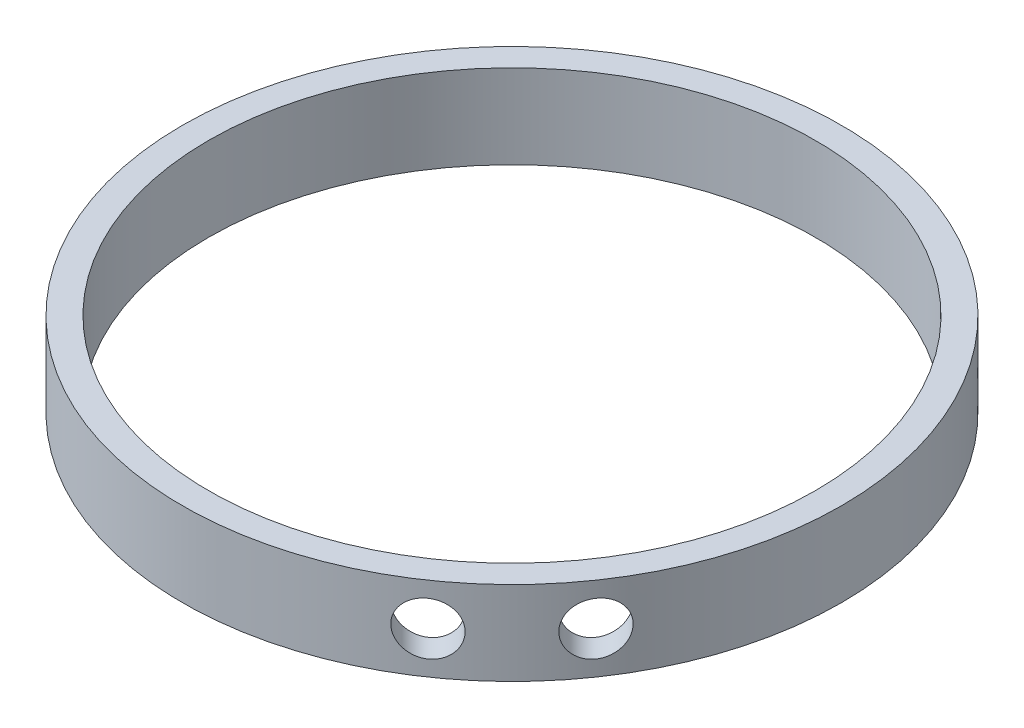
ISO-10303-21;
HEADER;
FILE_DESCRIPTION(('STEP AP214'),'2;1');
FILE_NAME('part.step','',(''),(''),'','','');
FILE_SCHEMA(('AUTOMOTIVE_DESIGN { 1 0 10303 214 1 1 1 1 }'));
ENDSEC;
DATA;
#1=APPLICATION_CONTEXT('core data for automotive mechanical design processes');
#2=APPLICATION_PROTOCOL_DEFINITION('international standard','automotive_design',2000,#1);
#3=PRODUCT_CONTEXT('',#1,'mechanical');
#4=PRODUCT('Part','Part','',(#3));
#5=PRODUCT_RELATED_PRODUCT_CATEGORY('part','',(#4));
#6=PRODUCT_DEFINITION_FORMATION('','',#4);
#7=PRODUCT_DEFINITION_CONTEXT('part definition',#1,'design');
#8=PRODUCT_DEFINITION('design','',#6,#7);
#9=PRODUCT_DEFINITION_SHAPE('','',#8);
#10=(LENGTH_UNIT() NAMED_UNIT(*) SI_UNIT(.MILLI.,.METRE.));
#11=(NAMED_UNIT(*) PLANE_ANGLE_UNIT() SI_UNIT($,.RADIAN.));
#12=(NAMED_UNIT(*) SI_UNIT($,.STERADIAN.) SOLID_ANGLE_UNIT());
#13=UNCERTAINTY_MEASURE_WITH_UNIT(LENGTH_MEASURE(1.E-05),#10,'distance_accuracy_value','');
#14=(GEOMETRIC_REPRESENTATION_CONTEXT(3) GLOBAL_UNCERTAINTY_ASSIGNED_CONTEXT((#13)) GLOBAL_UNIT_ASSIGNED_CONTEXT((#10,
#11,#12)) REPRESENTATION_CONTEXT('',''));
#15=CARTESIAN_POINT('',(0.,0.,0.));
#16=DIRECTION('',(0.,0.,1.));
#17=DIRECTION('',(1.,0.,0.));
#18=AXIS2_PLACEMENT_3D('',#15,#16,#17);
#19=CARTESIAN_POINT('',(50.6984,108.966,0.));
#20=DIRECTION('',(0.,-1.,0.));
#21=DIRECTION('',(1.,0.,0.));
#22=AXIS2_PLACEMENT_3D('',#19,#20,#21);
#23=PLANE('',#22);
#24=CARTESIAN_POINT('',(0.,108.966,0.));
#25=DIRECTION('',(0.,1.,0.));
#26=DIRECTION('',(-1.,0.,0.));
#27=AXIS2_PLACEMENT_3D('',#24,#25,#26);
#28=CIRCLE('',#27,52.832);
#29=CARTESIAN_POINT('',(-52.832,108.966,0.));
#30=VERTEX_POINT('',#29);
#31=EDGE_CURVE('E49',#30,#30,#28,.T.);
#32=ORIENTED_EDGE('',*,*,#31,.T.);
#33=EDGE_LOOP('',(#32));
#34=FACE_BOUND('',#33,.T.);
#35=CARTESIAN_POINT('',(0.,108.966,0.));
#36=DIRECTION('',(0.,-1.,0.));
#37=DIRECTION('',(1.,0.,0.));
#38=AXIS2_PLACEMENT_3D('',#35,#36,#37);
#39=CIRCLE('',#38,48.641);
#40=CARTESIAN_POINT('',(48.641,108.966,0.));
#41=VERTEX_POINT('',#40);
#42=EDGE_CURVE('E93',#41,#41,#39,.T.);
#43=ORIENTED_EDGE('',*,*,#42,.T.);
#44=EDGE_LOOP('',(#43));
#45=FACE_BOUND('',#44,.T.);
#46=ADVANCED_FACE('F37',(#34,#45),#23,.F.);
#47=CARTESIAN_POINT('',(0.,138.931800571307,0.));
#48=DIRECTION('',(0.,1.,0.));
#49=DIRECTION('',(-1.,0.,0.));
#50=AXIS2_PLACEMENT_3D('',#47,#48,#49);
#51=CYLINDRICAL_SURFACE('',#50,52.832);
#52=CARTESIAN_POINT('',(35.9911854648936,102.235,-38.6762820450936));
#53=CARTESIAN_POINT('',(35.9911891251565,102.128388948194,-38.6762790353523));
#54=CARTESIAN_POINT('',(35.9977870100752,102.021701469772,-38.6701420674387));
#55=CARTESIAN_POINT('',(36.0239957140699,101.811267276668,-38.6457276445082));
#56=CARTESIAN_POINT('',(36.043622025432,101.707524216566,-38.6274357358532));
#57=CARTESIAN_POINT('',(36.0952698779711,101.506057813562,-38.5791777823933));
#58=CARTESIAN_POINT('',(36.1272852928998,101.408331523088,-38.5492175073947));
#59=CARTESIAN_POINT('',(36.2027070266943,101.221649723681,-38.4783951198653));
#60=CARTESIAN_POINT('',(36.2461105873962,101.132692098181,-38.4375356470373));
#61=CARTESIAN_POINT('',(36.3429988416192,100.96599296856,-38.345939712509));
#62=CARTESIAN_POINT('',(36.3964886465669,100.888257186777,-38.2951982424591));
#63=CARTESIAN_POINT('',(36.511905302874,100.746256785229,-38.1851717077652));
#64=CARTESIAN_POINT('',(36.5738324920968,100.681992705181,-38.1258863009854));
#65=CARTESIAN_POINT('',(36.7042725394263,100.568748154399,-38.0003261293154));
#66=CARTESIAN_POINT('',(36.7727870537462,100.519771540518,-37.93404960628));
#67=CARTESIAN_POINT('',(36.9143499540226,100.43851712426,-37.7963058372317));
#68=CARTESIAN_POINT('',(36.9873983178574,100.406239240414,-37.724838616545));
#69=CARTESIAN_POINT('',(37.1358550292209,100.359312002503,-37.5787085060975));
#70=CARTESIAN_POINT('',(37.2112623346822,100.344654974139,-37.5040470221966));
#71=CARTESIAN_POINT('',(37.3622933241103,100.333361847808,-37.3535891440961));
#72=CARTESIAN_POINT('',(37.4379170070065,100.336725660826,-37.2777927555043));
#73=CARTESIAN_POINT('',(37.5872047581345,100.361372296027,-37.1272608371456));
#74=CARTESIAN_POINT('',(37.6608697150397,100.382646843909,-37.0525248337166));
#75=CARTESIAN_POINT('',(37.8042316035084,100.442498233258,-36.9062432670479));
#76=CARTESIAN_POINT('',(37.8739285244002,100.481075121256,-36.8346977123888));
#77=CARTESIAN_POINT('',(38.0074723074687,100.574445613952,-36.6968866836979));
#78=CARTESIAN_POINT('',(38.0713177990794,100.62924300529,-36.6306224471678));
#79=CARTESIAN_POINT('',(38.1914340384486,100.753496211505,-36.5053712780388));
#80=CARTESIAN_POINT('',(38.2477047600365,100.822952077023,-36.446384370583));
#81=CARTESIAN_POINT('',(38.3512218164106,100.974597453319,-36.3374417403975));
#82=CARTESIAN_POINT('',(38.3984630300379,101.056794142586,-36.2874911435394));
#83=CARTESIAN_POINT('',(38.4826556609733,101.231562610481,-36.1981935454399));
#84=CARTESIAN_POINT('',(38.5196070763824,101.324134391024,-36.1588465461553));
#85=CARTESIAN_POINT('',(38.5822717844099,101.517029415104,-36.0919747096342));
#86=CARTESIAN_POINT('',(38.6079849087677,101.617352774671,-36.0644500494028));
#87=CARTESIAN_POINT('',(38.6475164071539,101.822901262283,-36.0220841469506));
#88=CARTESIAN_POINT('',(38.6613348275305,101.928126371226,-36.0072428553084));
#89=CARTESIAN_POINT('',(38.6767217960953,102.140428338628,-35.9907147107065));
#90=CARTESIAN_POINT('',(38.6782971928635,102.247504128238,-35.9890205034482));
#91=CARTESIAN_POINT('',(38.6691762593249,102.460523355244,-35.9988204600144));
#92=CARTESIAN_POINT('',(38.6584799496777,102.566466794546,-36.010314601636));
#93=CARTESIAN_POINT('',(38.6250912417336,102.774185901556,-36.0461252209459));
#94=CARTESIAN_POINT('',(38.6024019687354,102.875962647639,-36.0704383580722));
#95=CARTESIAN_POINT('',(38.5456061073569,103.072492434298,-36.1311249623008));
#96=CARTESIAN_POINT('',(38.5114994854134,103.167245454226,-36.1674984648565));
#97=CARTESIAN_POINT('',(38.4327238287584,103.347084341653,-36.251196597733));
#98=CARTESIAN_POINT('',(38.3880501003922,103.432165888381,-36.2985260942427));
#99=CARTESIAN_POINT('',(38.2893030662616,103.590203258514,-36.4026733963121));
#100=CARTESIAN_POINT('',(38.2352297276956,103.663159039602,-36.4594912349831));
#101=CARTESIAN_POINT('',(38.1190729837629,103.794907505079,-36.5809178098473));
#102=CARTESIAN_POINT('',(38.0569859342879,103.85369371099,-36.64553008956));
#103=CARTESIAN_POINT('',(37.9264752799857,103.955390016683,-36.7805859584982));
#104=CARTESIAN_POINT('',(37.8580516927094,103.998300160437,-36.8510295315723));
#105=CARTESIAN_POINT('',(37.7167420562791,104.067014919109,-36.995645720619));
#106=CARTESIAN_POINT('',(37.6438571033809,104.092823717918,-37.0698174197141));
#107=CARTESIAN_POINT('',(37.4956255624286,104.126616883972,-37.2197447052237));
#108=CARTESIAN_POINT('',(37.4202789793993,104.134601287597,-37.295500288405));
#109=CARTESIAN_POINT('',(37.2692914252668,104.132518545475,-37.4463820050562));
#110=CARTESIAN_POINT('',(37.1936506444338,104.122461591004,-37.5215084698223));
#111=CARTESIAN_POINT('',(37.0442013161862,104.084602607981,-37.6690642921508));
#112=CARTESIAN_POINT('',(36.9703927723641,104.056800544638,-37.7414936444246));
#113=CARTESIAN_POINT('',(36.8267589213333,103.984242239172,-37.881659542266));
#114=CARTESIAN_POINT('',(36.7569336743323,103.93948574086,-37.9493960169037));
#115=CARTESIAN_POINT('',(36.6233364041532,103.834291732404,-38.078341416311));
#116=CARTESIAN_POINT('',(36.5595641702965,103.773854768302,-38.1395505682772));
#117=CARTESIAN_POINT('',(36.4399559147707,103.638982329924,-38.253845503396));
#118=CARTESIAN_POINT('',(36.3841235403764,103.564540458556,-38.3069275541142));
#119=CARTESIAN_POINT('',(36.2821148122894,103.403762323211,-38.4035586891762));
#120=CARTESIAN_POINT('',(36.2359408491869,103.317423123232,-38.4471054135196));
#121=CARTESIAN_POINT('',(36.154659073159,103.135259116699,-38.5235509361549));
#122=CARTESIAN_POINT('',(36.1195592939607,103.039427489813,-38.5564420048014));
#123=CARTESIAN_POINT('',(36.0615953242634,102.841120551884,-38.6106611806726));
#124=CARTESIAN_POINT('',(36.0387165771221,102.738653308543,-38.6320030447147));
#125=CARTESIAN_POINT('',(36.0119587205039,102.568784464662,-38.6569429440298));
#126=CARTESIAN_POINT('',(36.0041794195579,102.502484907529,-38.6641867821554));
#127=CARTESIAN_POINT('',(35.9937916413014,102.36913365298,-38.6738572785532));
#128=CARTESIAN_POINT('',(35.9911831617778,102.302081955887,-38.6762839388873));
#129=CARTESIAN_POINT('',(35.9911854648936,102.235,-38.6762820450936));
#130=B_SPLINE_CURVE_WITH_KNOTS('',3,(#52,#53,#54,#55,#56,#57,#58,#59,#60,#61,#62,#63,#64,#65,
#66,#67,#68,#69,#70,#71,#72,#73,#74,#75,#76,#77,#78,#79,#80,#81,#82,#83,#84,#85,#86,#87,#88,#89,
#90,#91,#92,#93,#94,#95,#96,#97,#98,#99,#100,#101,#102,#103,#104,#105,#106,#107,#108,#109,#110,
#111,#112,#113,#114,#115,#116,#117,#118,#119,#120,#121,#122,#123,#124,#125,#126,#127,#128,#129),
.UNSPECIFIED.,.T.,.F.,(4,2,2,2,2,2,2,2,2,2,2,2,2,2,2,2,2,2,2,2,2,2,2,2,2,2,2,2,2,2,2,2,2,2,2,2,
2,2,4),(0.,0.319588293392277,0.639557296123156,0.95936828016603,1.27910187863723,
1.59899794675794,1.91890682844399,2.23889635437036,2.55888431912336,2.87873287101168,
3.19857984299758,3.51827913491017,3.83797928659264,4.15775413050739,4.47753007921197,
4.79748685676229,5.11744369336031,5.43740532021613,5.7573657003217,6.07714708606956,
6.39692793345835,6.71662548881663,7.03632398398792,7.35616474908745,7.67600663035106,
7.99599447046622,8.31598142431616,8.63589006353334,8.95579804976985,9.27552538196366,
9.59525334103685,9.91498613153832,10.2347077894689,10.554575844427,10.8745229777065,
11.1947016846305,11.5144981669767,11.7155900482812,11.9166818435123),.UNSPECIFIED.);
#131=CARTESIAN_POINT('',(35.9911854648936,102.235,-38.6762820450936));
#132=VERTEX_POINT('',#131);
#133=EDGE_CURVE('E10',#132,#132,#130,.T.);
#134=ORIENTED_EDGE('',*,*,#133,.T.);
#135=EDGE_LOOP('',(#134));
#136=FACE_BOUND('',#135,.T.);
#137=CARTESIAN_POINT('',(45.7887465015735,102.235,26.3554722555798));
#138=CARTESIAN_POINT('',(45.7887469768974,102.119294353157,26.3554711506068));
#139=CARTESIAN_POINT('',(45.7862851066702,102.003604677743,26.3597498776435));
#140=CARTESIAN_POINT('',(45.7764529513878,101.77302536689,26.3768208803745));
#141=CARTESIAN_POINT('',(45.7690813264415,101.658135958498,26.3896154800829));
#142=CARTESIAN_POINT('',(45.749465389697,101.429933427851,26.4236073240889));
#143=CARTESIAN_POINT('',(45.7372170611276,101.31662168489,26.4448114950016));
#144=CARTESIAN_POINT('',(45.7079187187507,101.0924348145,26.4954193148572));
#145=CARTESIAN_POINT('',(45.690866913648,100.981560612729,26.5248260226203));
#146=CARTESIAN_POINT('',(45.6520967395134,100.763247326726,26.5914980883896));
#147=CARTESIAN_POINT('',(45.630386472878,100.655802645652,26.6287497996316));
#148=CARTESIAN_POINT('',(45.5824127825326,100.444865310929,26.7107866437121));
#149=CARTESIAN_POINT('',(45.5561476817662,100.341374130116,26.7555745511412));
#150=CARTESIAN_POINT('',(45.4707567592938,100.037994553879,26.9006155141694));
#151=CARTESIAN_POINT('',(45.4049885345326,99.8449368518761,27.0116269453659));
#152=CARTESIAN_POINT('',(45.2559818971568,99.4792339202398,27.2605513800785));
#153=CARTESIAN_POINT('',(45.1724567500596,99.3070070903629,27.3989029053204));
#154=CARTESIAN_POINT('',(44.9904377536082,98.991080089496,27.6967716139618));
#155=CARTESIAN_POINT('',(44.8919412510913,98.8473849852125,27.8562925482804));
#156=CARTESIAN_POINT('',(44.6789353889756,98.588199780565,28.1967090218338));
#157=CARTESIAN_POINT('',(44.5640344370214,98.4736846219928,28.3781020592051));
#158=CARTESIAN_POINT('',(44.3232249518875,98.2815891627024,28.7527653797535));
#159=CARTESIAN_POINT('',(44.1973152761317,98.2040127011853,28.9460368951571));
#160=CARTESIAN_POINT('',(43.9355356760905,98.0870481639952,29.3418820111879));
#161=CARTESIAN_POINT('',(43.7995429565049,98.0482617185712,29.5445526228933));
#162=CARTESIAN_POINT('',(43.5229792739286,98.0122809948412,29.9504724406895));
#163=CARTESIAN_POINT('',(43.3824083946243,98.015085956692,30.1537216361421));
#164=CARTESIAN_POINT('',(43.1014628339092,98.0624166959423,30.5539460400328));
#165=CARTESIAN_POINT('',(42.961090626198,98.1067358676786,30.7509473265223));
#166=CARTESIAN_POINT('',(42.6842290739996,98.2358837372617,31.1341082964233));
#167=CARTESIAN_POINT('',(42.5477394163231,98.3207091577615,31.3202688555876));
#168=CARTESIAN_POINT('',(42.2852231881424,98.5271059374471,31.6737734105617));
#169=CARTESIAN_POINT('',(42.1590689644525,98.6480982328062,31.8413607178014));
#170=CARTESIAN_POINT('',(41.919286769872,98.9239850936208,32.1563813755126));
#171=CARTESIAN_POINT('',(41.8056578823957,99.0788771758601,32.3038162009028));
#172=CARTESIAN_POINT('',(41.5963865738241,99.4159361339375,32.5728350654279));
#173=CARTESIAN_POINT('',(41.5005271781607,99.597717349688,32.6947336963483));
#174=CARTESIAN_POINT('',(41.3284198886111,99.9848759584561,32.9120222352762));
#175=CARTESIAN_POINT('',(41.2521712470923,100.190252451505,33.0074131538645));
#176=CARTESIAN_POINT('',(41.1225175678328,100.617280682712,33.1688026521253));
#177=CARTESIAN_POINT('',(41.0689637256353,100.838814876238,33.2349928156349));
#178=CARTESIAN_POINT('',(40.9859299156716,101.293051132158,33.3373387162699));
#179=CARTESIAN_POINT('',(40.9564496141447,101.525753039672,33.3734948697934));
#180=CARTESIAN_POINT('',(40.9226877477209,101.995178680484,33.4148855628808));
#181=CARTESIAN_POINT('',(40.9183518374982,102.231892630195,33.4201867902116));
#182=CARTESIAN_POINT('',(40.9348925084418,102.703107743698,33.3999245994594));
#183=CARTESIAN_POINT('',(40.9557689615406,102.937608918722,33.374361338154));
#184=CARTESIAN_POINT('',(41.0219538357132,103.397655992415,33.2929759492939));
#185=CARTESIAN_POINT('',(41.0672535445863,103.623205053675,33.2371646117176));
#186=CARTESIAN_POINT('',(41.180620786122,104.059042960559,33.09659801454));
#187=CARTESIAN_POINT('',(41.2486882045293,104.269331882757,33.0118429001872));
#188=CARTESIAN_POINT('',(41.4051753787734,104.668844340732,32.8153530804978));
#189=CARTESIAN_POINT('',(41.4936081434409,104.85805429672,32.7036011280679));
#190=CARTESIAN_POINT('',(41.6876466103197,105.209959721522,32.4558936032796));
#191=CARTESIAN_POINT('',(41.793252342508,105.372655144052,32.3199379886716));
#192=CARTESIAN_POINT('',(42.0182988648291,105.667507884818,32.0268162427235));
#193=CARTESIAN_POINT('',(42.137779560571,105.799573673035,31.8695887061782));
#194=CARTESIAN_POINT('',(42.3862984866412,106.029041672343,31.5383061200087));
#195=CARTESIAN_POINT('',(42.5153369946552,106.126442875838,31.3642505814313));
#196=CARTESIAN_POINT('',(42.7799041163965,106.284792351173,31.0024291627716));
#197=CARTESIAN_POINT('',(42.9154767414472,106.345439761223,30.8145638771563));
#198=CARTESIAN_POINT('',(43.1879978047673,106.427695695312,30.4314365397767));
#199=CARTESIAN_POINT('',(43.3249463491987,106.449301183367,30.2361739139844));
#200=CARTESIAN_POINT('',(43.5982629846486,106.453234830852,29.8407483297478));
#201=CARTESIAN_POINT('',(43.7345953191447,106.435001790714,29.6405551449591));
#202=CARTESIAN_POINT('',(44.0010279639457,106.358860876206,29.243579417199));
#203=CARTESIAN_POINT('',(44.1311276501855,106.300949037708,29.0467972170176));
#204=CARTESIAN_POINT('',(44.38363692113,106.146055503281,28.6595053946507));
#205=CARTESIAN_POINT('',(44.505909637687,106.048525981876,28.4691260186579));
#206=CARTESIAN_POINT('',(44.7378133158577,105.816919089062,28.1032949071589));
#207=CARTESIAN_POINT('',(44.8474440745582,105.682841131139,27.9278434112685));
#208=CARTESIAN_POINT('',(45.0004484018116,105.457066064935,27.6801264283481));
#209=CARTESIAN_POINT('',(45.0496013338218,105.377574255038,27.6000333996515));
#210=CARTESIAN_POINT('',(45.1437974703461,105.210877960648,27.4456903958673));
#211=CARTESIAN_POINT('',(45.1888422778439,105.123676510829,27.3714381432867));
#212=CARTESIAN_POINT('',(45.2745817457268,104.94208632823,27.2293842859287));
#213=CARTESIAN_POINT('',(45.3152738914651,104.847693494137,27.1615864124762));
#214=CARTESIAN_POINT('',(45.3920230621743,104.652446841802,27.0331289698074));
#215=CARTESIAN_POINT('',(45.4280820019958,104.551595718685,26.9724664525127));
#216=CARTESIAN_POINT('',(45.4947322172362,104.346048992562,26.8598913991031));
#217=CARTESIAN_POINT('',(45.5254129726214,104.241460259918,26.8078366967363));
#218=CARTESIAN_POINT('',(45.581915943942,104.027491003117,26.7116505363275));
#219=CARTESIAN_POINT('',(45.6077401542748,103.918112468797,26.6675158261898));
#220=CARTESIAN_POINT('',(45.654358829557,103.695429206873,26.5876265082524));
#221=CARTESIAN_POINT('',(45.6751585621778,103.582128734816,26.5518631251693));
#222=CARTESIAN_POINT('',(45.7116236136711,103.352377498124,26.4890356186028));
#223=CARTESIAN_POINT('',(45.7272904571494,103.235927680075,26.4619689120194));
#224=CARTESIAN_POINT('',(45.7564210400799,102.973448610384,26.4115733304544));
#225=CARTESIAN_POINT('',(45.7685337059033,102.826816218828,26.3905627956786));
#226=CARTESIAN_POINT('',(45.7846960420405,102.531780437004,26.3625131224042));
#227=CARTESIAN_POINT('',(45.7887458920339,102.383377086276,26.3554736725605));
#228=CARTESIAN_POINT('',(45.7887465015735,102.235,26.3554722555798));
#229=B_SPLINE_CURVE_WITH_KNOTS('',3,(#137,#138,#139,#140,#141,#142,#143,#144,#145,#146,#147,
#148,#149,#150,#151,#152,#153,#154,#155,#156,#157,#158,#159,#160,#161,#162,#163,#164,#165,#166,
#167,#168,#169,#170,#171,#172,#173,#174,#175,#176,#177,#178,#179,#180,#181,#182,#183,#184,#185,
#186,#187,#188,#189,#190,#191,#192,#193,#194,#195,#196,#197,#198,#199,#200,#201,#202,#203,#204,
#205,#206,#207,#208,#209,#210,#211,#212,#213,#214,#215,#216,#217,#218,#219,#220,#221,#222,#223,
#224,#225,#226,#227,#228),.UNSPECIFIED.,.T.,.F.,(4,2,2,2,2,2,2,2,2,2,2,2,2,2,2,2,2,2,2,2,2,2,2,
2,2,2,2,2,2,2,2,2,2,2,2,2,2,2,2,2,2,2,2,2,2,4),(0.,0.346984332137615,0.694063396468765,
1.04142893111864,1.38892417594664,1.73581985661889,2.08284353395555,2.77606287187729,
3.48146601807491,4.18699431900244,4.91367823951538,5.64043767100476,6.378301973798,
7.11615279639117,7.85035092342221,8.58448965678939,9.30745216721666,10.0303617371412,
10.7437601523616,11.4571313662301,12.1657499555024,12.8743587201692,13.5814353750255,
14.2885084382666,14.995329442953,15.7021469006536,16.4094171126918,17.1166885593493,
17.8260470575306,18.5354261729827,19.2505363838565,19.9657022008668,20.6910073261841,
21.4163849240025,22.1521542074707,22.8879352989592,23.2568209177431,23.6255619765381,
23.9945149290288,24.3633149036573,24.7252322732976,25.087000691194,25.44838816814,
25.8096682057877,26.2546393282842,26.6996005345037),.UNSPECIFIED.);
#230=CARTESIAN_POINT('',(45.7887465015735,102.235,26.3554722555798));
#231=VERTEX_POINT('',#230);
#232=EDGE_CURVE('E60',#231,#231,#229,.T.);
#233=ORIENTED_EDGE('',*,*,#232,.T.);
#234=EDGE_LOOP('',(#233));
#235=FACE_BOUND('',#234,.T.);
#236=CARTESIAN_POINT('',(33.4150502722189,102.235,40.9225443894326));
#237=CARTESIAN_POINT('',(33.4150432446465,101.999249872019,40.9225519275344));
#238=CARTESIAN_POINT('',(33.3996135144003,101.763338146185,40.9351642200645));
#239=CARTESIAN_POINT('',(33.338198076955,101.298028105622,40.9851958857016));
#240=CARTESIAN_POINT('',(33.2921776055408,101.068637511327,41.0226434822657));
#241=CARTESIAN_POINT('',(33.1706582061017,100.623168814806,41.1209646190815));
#242=CARTESIAN_POINT('',(33.0951736216175,100.407084294167,41.1818267605996));
#243=CARTESIAN_POINT('',(32.9165388032736,99.9943005426802,41.3247470306754));
#244=CARTESIAN_POINT('',(32.8133952074522,99.7975966760306,41.4068000733381));
#245=CARTESIAN_POINT('',(32.581830433631,99.4288455996199,41.589256213939));
#246=CARTESIAN_POINT('',(32.453384312118,99.2568230125152,41.6896774123726));
#247=CARTESIAN_POINT('',(32.1744909928582,98.9424224994399,41.9052903166819));
#248=CARTESIAN_POINT('',(32.0240428243128,98.8000458822138,42.0204826742795));
#249=CARTESIAN_POINT('',(31.7043102887013,98.5482202405646,42.2622433477628));
#250=CARTESIAN_POINT('',(31.5349471913656,98.4389164430616,42.388858756057));
#251=CARTESIAN_POINT('',(31.1823708282104,98.256872248922,42.6488911932475));
#252=CARTESIAN_POINT('',(30.9991569624093,98.1841334372367,42.7823085167047));
#253=CARTESIAN_POINT('',(30.6218120387886,98.0763598555263,43.0532149002316));
#254=CARTESIAN_POINT('',(30.4275881391548,98.0417202319882,43.1907317137458));
#255=CARTESIAN_POINT('',(30.0352535421622,98.0121009666629,43.4644797384357));
#256=CARTESIAN_POINT('',(29.8371425098051,98.0171247582291,43.6007108372952));
#257=CARTESIAN_POINT('',(29.4394262629207,98.0667950891109,43.8702517951056));
#258=CARTESIAN_POINT('',(29.2398446751664,98.11204764669,44.0034848950975));
#259=CARTESIAN_POINT('',(28.8479461009743,98.2415971470128,44.2613974690661));
#260=CARTESIAN_POINT('',(28.655629808078,98.3258978071344,44.3860761273625));
#261=CARTESIAN_POINT('',(28.2817307586343,98.5324520588184,44.6252595276468));
#262=CARTESIAN_POINT('',(28.1002985957217,98.6551350500591,44.7396292978547));
#263=CARTESIAN_POINT('',(27.7563206751103,98.9348850275003,44.9538430379232));
#264=CARTESIAN_POINT('',(27.5937750842191,99.0919523173502,45.0536868794915));
#265=CARTESIAN_POINT('',(27.2937979077102,99.4354410148417,45.2360424764529));
#266=CARTESIAN_POINT('',(27.1562408526952,99.6217064969634,45.3186411523858));
#267=CARTESIAN_POINT('',(26.9101845611396,100.019124292741,45.4651819605987));
#268=CARTESIAN_POINT('',(26.8016808674123,100.230272781834,45.5291269547458));
#269=CARTESIAN_POINT('',(26.6203290462736,100.665746340536,45.635393321464));
#270=CARTESIAN_POINT('',(26.5466393765446,100.88959581596,45.6782262717745));
#271=CARTESIAN_POINT('',(26.4338457775264,101.348676967579,45.7435932736138));
#272=CARTESIAN_POINT('',(26.3947347471159,101.58390629632,45.7661314929168));
#273=CARTESIAN_POINT('',(26.3533565581896,102.051558915164,45.7899702170729));
#274=CARTESIAN_POINT('',(26.3500291320695,102.283857888073,45.7918818918643));
#275=CARTESIAN_POINT('',(26.3775970097072,102.745720983245,45.7760073358555));
#276=CARTESIAN_POINT('',(26.4084896836097,102.975285314298,45.7582226187465));
#277=CARTESIAN_POINT('',(26.5027884409109,103.422893459685,45.7036685949148));
#278=CARTESIAN_POINT('',(26.5658744925304,103.641027795092,45.6670861307305));
#279=CARTESIAN_POINT('',(26.7220038909998,104.062276388555,45.5759021667251));
#280=CARTESIAN_POINT('',(26.8150495034517,104.265389509247,45.5212993041575));
#281=CARTESIAN_POINT('',(27.0297260337878,104.654837699242,45.3941616810539));
#282=CARTESIAN_POINT('',(27.1518370048666,104.840809085083,45.3213245805722));
#283=CARTESIAN_POINT('',(27.4196004740426,105.187167736381,45.1598287470435));
#284=CARTESIAN_POINT('',(27.5652566540093,105.3475509927,45.071167539284));
#285=CARTESIAN_POINT('',(27.8803535024453,105.643350616093,44.876957718349));
#286=CARTESIAN_POINT('',(28.050385934898,105.77785201205,44.770975103257));
#287=CARTESIAN_POINT('',(28.4054450114346,106.012219213811,44.5465486429774));
#288=CARTESIAN_POINT('',(28.590473579847,106.112080565839,44.4281031979559));
#289=CARTESIAN_POINT('',(28.9741919202578,106.27631290778,44.1788389815857));
#290=CARTESIAN_POINT('',(29.1730885295979,106.339884025415,44.0478106502201));
#291=CARTESIAN_POINT('',(29.5750748159311,106.426321659144,43.7789176249928));
#292=CARTESIAN_POINT('',(29.7781645830072,106.449187299828,43.641052784171));
#293=CARTESIAN_POINT('',(30.1828388180644,106.453307631185,43.3621596114406));
#294=CARTESIAN_POINT('',(30.3844220203991,106.434530585301,43.2211289478862));
#295=CARTESIAN_POINT('',(30.7801284992184,106.355482220755,42.940223500495));
#296=CARTESIAN_POINT('',(30.9742522921927,106.295213780444,42.8003486371589));
#297=CARTESIAN_POINT('',(31.3469499998364,106.135686461532,42.5281263829309));
#298=CARTESIAN_POINT('',(31.5256989473785,106.036966864719,42.3957026857377));
#299=CARTESIAN_POINT('',(31.8656011585399,105.803104412623,42.1408217691322));
#300=CARTESIAN_POINT('',(32.02675649291,105.667965850326,42.0183633772462));
#301=CARTESIAN_POINT('',(32.3248775764817,105.367285486626,41.7894411165149));
#302=CARTESIAN_POINT('',(32.4621660418137,105.202223271158,41.6827673458141));
#303=CARTESIAN_POINT('',(32.7119168816158,104.844995507904,41.4870577780169));
#304=CARTESIAN_POINT('',(32.8243745970409,104.652824884778,41.3980252913121));
#305=CARTESIAN_POINT('',(33.020784951241,104.24861571896,41.2415285568495));
#306=CARTESIAN_POINT('',(33.1049632126197,104.036752533644,41.1738938564572));
#307=CARTESIAN_POINT('',(33.2439772642713,103.59802182904,41.0617370671731));
#308=CARTESIAN_POINT('',(33.2988471135659,103.371172071653,41.0171881523181));
#309=CARTESIAN_POINT('',(33.3639162082907,102.991639427934,40.9642566686684));
#310=CARTESIAN_POINT('',(33.3830704102588,102.841401282249,40.9486399066523));
#311=CARTESIAN_POINT('',(33.4086397014157,102.539131177733,40.9277813417044));
#312=CARTESIAN_POINT('',(33.415054806207,102.387099221099,40.9225395260655));
#313=CARTESIAN_POINT('',(33.4150502722189,102.235,40.9225443894326));
#314=B_SPLINE_CURVE_WITH_KNOTS('',3,(#236,#237,#238,#239,#240,#241,#242,#243,#244,#245,#246,
#247,#248,#249,#250,#251,#252,#253,#254,#255,#256,#257,#258,#259,#260,#261,#262,#263,#264,#265,
#266,#267,#268,#269,#270,#271,#272,#273,#274,#275,#276,#277,#278,#279,#280,#281,#282,#283,#284,
#285,#286,#287,#288,#289,#290,#291,#292,#293,#294,#295,#296,#297,#298,#299,#300,#301,#302,#303,
#304,#305,#306,#307,#308,#309,#310,#311,#312,#313),.UNSPECIFIED.,.T.,.F.,(4,2,2,2,2,2,2,2,2,2,2,
2,2,2,2,2,2,2,2,2,2,2,2,2,2,2,2,2,2,2,2,2,2,2,2,2,2,2,4),(0.,0.706695774852987,1.41419603567282,
2.1213523042066,2.82833901007428,3.53602619101719,4.24374460674281,4.95452705036979,
5.66534030102313,6.38345820981671,7.10163828117412,7.83082408946343,8.56007933048288,
9.29780384256227,10.0355348697875,10.7694526255155,11.5032577235358,12.2182806094715,
12.9331566230977,13.6267903805954,14.3203708352126,15.0071870100596,15.694055135526,
16.3931689569337,17.0923922078375,17.8130279283181,18.5337562688015,19.2698111223833,
20.0058818053489,20.7425136523227,21.4790944026506,22.2056963711167,22.9322127268427,
23.6479762763223,24.3638740120846,25.0739163515986,25.783131752657,26.2390721565013,
26.6950120019194),.UNSPECIFIED.);
#315=CARTESIAN_POINT('',(33.4150502722189,102.235,40.9225443894326));
#316=VERTEX_POINT('',#315);
#317=EDGE_CURVE('E101',#316,#316,#314,.T.);
#318=ORIENTED_EDGE('',*,*,#317,.T.);
#319=EDGE_LOOP('',(#318));
#320=FACE_BOUND('',#319,.T.);
#321=ORIENTED_EDGE('',*,*,#31,.F.);
#322=EDGE_LOOP('',(#321));
#323=FACE_BOUND('',#322,.T.);
#324=CARTESIAN_POINT('',(0.,95.504,0.));
#325=DIRECTION('',(0.,1.,0.));
#326=DIRECTION('',(-1.,0.,0.));
#327=AXIS2_PLACEMENT_3D('',#324,#325,#326);
#328=CIRCLE('',#327,52.832);
#329=CARTESIAN_POINT('',(-52.832,95.504,0.));
#330=VERTEX_POINT('',#329);
#331=EDGE_CURVE('E54',#330,#330,#328,.T.);
#332=ORIENTED_EDGE('',*,*,#331,.T.);
#333=EDGE_LOOP('',(#332));
#334=FACE_BOUND('',#333,.T.);
#335=ADVANCED_FACE('F66',(#136,#235,#320,#323,#334),#51,.T.);
#336=CARTESIAN_POINT('',(52.832,95.504,0.));
#337=DIRECTION('',(0.,1.,0.));
#338=DIRECTION('',(-1.,0.,0.));
#339=AXIS2_PLACEMENT_3D('',#336,#337,#338);
#340=PLANE('',#339);
#341=CARTESIAN_POINT('',(0.,95.504,0.));
#342=DIRECTION('',(0.,-1.,0.));
#343=DIRECTION('',(1.,0.,0.));
#344=AXIS2_PLACEMENT_3D('',#341,#342,#343);
#345=CIRCLE('',#344,48.641);
#346=CARTESIAN_POINT('',(48.641,95.504,0.));
#347=VERTEX_POINT('',#346);
#348=EDGE_CURVE('E136',#347,#347,#345,.T.);
#349=ORIENTED_EDGE('',*,*,#348,.F.);
#350=EDGE_LOOP('',(#349));
#351=FACE_BOUND('',#350,.T.);
#352=ORIENTED_EDGE('',*,*,#331,.F.);
#353=EDGE_LOOP('',(#352));
#354=FACE_BOUND('',#353,.T.);
#355=ADVANCED_FACE('F115',(#351,#354),#340,.F.);
#356=CARTESIAN_POINT('',(30.6226733728459,102.235,44.0930575544495));
#357=DIRECTION('',(0.707106781186549,0.,0.707106781186546));
#358=DIRECTION('',(0.707106781186546,0.,-0.707106781186549));
#359=AXIS2_PLACEMENT_3D('',#356,#357,#358);
#360=CYLINDRICAL_SURFACE('',#359,4.21639999999999);
#361=CARTESIAN_POINT('',(30.4351813176965,102.235,37.9426754349102));
#362=CARTESIAN_POINT('',(30.4351743355523,101.99944599562,37.9426829659169));
#363=CARTESIAN_POINT('',(30.4196475912068,101.763732061611,37.9551517907548));
#364=CARTESIAN_POINT('',(30.3578414656586,101.298814922458,38.0046029995685));
#365=CARTESIAN_POINT('',(30.3115274312146,101.069619357672,38.0416130062385));
#366=CARTESIAN_POINT('',(30.189217358597,100.624530843604,38.1387480057138));
#367=CARTESIAN_POINT('',(30.113235821002,100.408631455145,38.1988617059075));
#368=CARTESIAN_POINT('',(29.9333957368575,99.9961983398058,38.3399491196911));
#369=CARTESIAN_POINT('',(29.829543840659,99.7996600083162,38.4209178567222));
#370=CARTESIAN_POINT('',(29.59632770775,99.4311764244364,38.6008538353581));
#371=CARTESIAN_POINT('',(29.4669343170875,99.2592596665476,38.699841634406));
#372=CARTESIAN_POINT('',(29.1859269291588,98.9450191190377,38.9122024804536));
#373=CARTESIAN_POINT('',(29.0343119295669,98.8026966649954,39.0255761763112));
#374=CARTESIAN_POINT('',(28.7119069709873,98.5507901438982,39.2633868202832));
#375=CARTESIAN_POINT('',(28.5410231254514,98.4413768176636,39.3878772633553));
#376=CARTESIAN_POINT('',(28.185189922933,98.2590223862079,39.6432829027353));
#377=CARTESIAN_POINT('',(28.0002398481951,98.1860831435846,39.7741984267736));
#378=CARTESIAN_POINT('',(27.6188617148592,98.077656269509,40.0399799643385));
#379=CARTESIAN_POINT('',(27.4223218260574,98.042632622398,40.1748746142533));
#380=CARTESIAN_POINT('',(27.0251606466091,98.012175190682,40.443108344836));
#381=CARTESIAN_POINT('',(26.824538945086,98.0167454114768,40.5764472667568));
#382=CARTESIAN_POINT('',(26.4210380740973,98.0654587569703,40.8403573282106));
#383=CARTESIAN_POINT('',(26.2181838113095,98.1103169780426,40.9708346252552));
#384=CARTESIAN_POINT('',(25.819646198712,98.2391689683398,41.2231540348787));
#385=CARTESIAN_POINT('',(25.6239636611877,98.3231671559592,41.3449951707574));
#386=CARTESIAN_POINT('',(25.2428498130798,98.5294620627004,41.5787940659477));
#387=CARTESIAN_POINT('',(25.0575986851967,98.6522746335274,41.6905910045019));
#388=CARTESIAN_POINT('',(24.7061871816687,98.9326142336994,41.8997980376037));
#389=CARTESIAN_POINT('',(24.5400270778254,99.0901417571932,41.9972079273264));
#390=CARTESIAN_POINT('',(24.2333587590774,99.4348101432963,42.1749035959427));
#391=CARTESIAN_POINT('',(24.0927057254942,99.6217717909002,42.255286514979));
#392=CARTESIAN_POINT('',(23.841081433807,100.020951710156,42.3977676094894));
#393=CARTESIAN_POINT('',(23.7301046760155,100.233165291503,42.4598691731291));
#394=CARTESIAN_POINT('',(23.5451920440963,100.670026287458,42.5626799003574));
#395=CARTESIAN_POINT('',(23.4702360032885,100.894102363885,42.6039800728535));
#396=CARTESIAN_POINT('',(23.3556235517619,101.353741739582,42.6669200109347));
#397=CARTESIAN_POINT('',(23.3159583854881,101.589302174313,42.6885646530227));
#398=CARTESIAN_POINT('',(23.2744112163206,102.056273269103,42.7112303440062));
#399=CARTESIAN_POINT('',(23.2712435796962,102.287536417404,42.7129531520556));
#400=CARTESIAN_POINT('',(23.299492391889,102.747288834444,42.6975501554941));
#401=CARTESIAN_POINT('',(23.3309057667225,102.975778347911,42.6804260262297));
#402=CARTESIAN_POINT('',(23.4264444567734,103.420827664998,42.6280596334829));
#403=CARTESIAN_POINT('',(23.4901883552937,103.637494656893,42.593028588396));
#404=CARTESIAN_POINT('',(23.6477079829887,104.055918599955,42.5057742989941));
#405=CARTESIAN_POINT('',(23.7414863685782,104.257674230337,42.4535495339607));
#406=CARTESIAN_POINT('',(23.9579884444556,104.64527261049,42.3317536201311));
#407=CARTESIAN_POINT('',(24.0812830652483,104.830687880892,42.2618385406041));
#408=CARTESIAN_POINT('',(24.3514869221182,105.176178321986,42.1067238233278));
#409=CARTESIAN_POINT('',(24.4984004502691,105.336248876475,42.0215214072067));
#410=CARTESIAN_POINT('',(24.8169635049869,105.6326192609,41.8342025499022));
#411=CARTESIAN_POINT('',(24.9893172589622,105.767845548839,41.7315844783996));
#412=CARTESIAN_POINT('',(25.3491810133062,106.003783909793,41.5139746565548));
#413=CARTESIAN_POINT('',(25.5366933181471,106.10449072276,41.3989810239396));
#414=CARTESIAN_POINT('',(25.9263258328778,106.270914765559,41.1561230792664));
#415=CARTESIAN_POINT('',(26.1286956882958,106.335681590167,41.028006620894));
#416=CARTESIAN_POINT('',(26.5377183993814,106.42431227237,40.7646357813789));
#417=CARTESIAN_POINT('',(26.7443713678428,106.448175051389,40.6293812121122));
#418=CARTESIAN_POINT('',(27.1562160914411,106.454016163908,40.355272862499));
#419=CARTESIAN_POINT('',(27.3614060838009,106.435950477645,40.2164154509299));
#420=CARTESIAN_POINT('',(27.764176829622,106.357935430813,39.9394179765665));
#421=CARTESIAN_POINT('',(27.9617582150218,106.297989556584,39.8012778550251));
#422=CARTESIAN_POINT('',(28.3405663746943,106.138844829808,39.5324210500812));
#423=CARTESIAN_POINT('',(28.522004401863,106.040290027722,39.4016209076799));
#424=CARTESIAN_POINT('',(28.8669718739414,105.806457007895,39.1495912156427));
#425=CARTESIAN_POINT('',(29.0305036999982,105.671183681287,39.0283603940889));
#426=CARTESIAN_POINT('',(29.3325277641386,105.370344382254,38.8018656786643));
#427=CARTESIAN_POINT('',(29.4714088037014,105.205351210935,38.6963590715411));
#428=CARTESIAN_POINT('',(29.7240399428432,104.848127598529,38.5026459203198));
#429=CARTESIAN_POINT('',(29.837785609283,104.655892362542,38.4144424282886));
#430=CARTESIAN_POINT('',(30.036273168521,104.251760718805,38.2594423690394));
#431=CARTESIAN_POINT('',(30.1212880990495,104.0400752121,38.1924446872229));
#432=CARTESIAN_POINT('',(30.2617400768597,103.601644828997,38.0812561022473));
#433=CARTESIAN_POINT('',(30.3172112872151,103.374917688914,38.0370388587222));
#434=CARTESIAN_POINT('',(30.3831908779006,102.994876692435,37.9843338623308));
#435=CARTESIAN_POINT('',(30.4026659771568,102.844007145411,37.9687379814239));
#436=CARTESIAN_POINT('',(30.4286634514225,102.540447483556,37.9479063334547));
#437=CARTESIAN_POINT('',(30.4351858456347,102.387757371424,37.9426705510332));
#438=CARTESIAN_POINT('',(30.4351813176965,102.235,37.9426754349102));
#439=B_SPLINE_CURVE_WITH_KNOTS('',3,(#361,#362,#363,#364,#365,#366,#367,#368,#369,#370,#371,
#372,#373,#374,#375,#376,#377,#378,#379,#380,#381,#382,#383,#384,#385,#386,#387,#388,#389,#390,
#391,#392,#393,#394,#395,#396,#397,#398,#399,#400,#401,#402,#403,#404,#405,#406,#407,#408,#409,
#410,#411,#412,#413,#414,#415,#416,#417,#418,#419,#420,#421,#422,#423,#424,#425,#426,#427,#428,
#429,#430,#431,#432,#433,#434,#435,#436,#437,#438),.UNSPECIFIED.,.T.,.F.,(4,2,2,2,2,2,2,2,2,2,2,
2,2,2,2,2,2,2,2,2,2,2,2,2,2,2,2,2,2,2,2,2,2,2,2,2,2,2,4),(0.,0.706105081344688,1.41300628196075,
2.11956240228249,2.82595007573452,3.53314875635276,4.2403793456309,4.95121832588152,
5.66209360237001,6.38157302215424,7.10112522685419,7.83370724362506,8.56637197944506,
9.30921528327166,10.0520691617581,10.7905635080881,11.5289208996574,12.2449130141747,
12.9607274437276,13.6512467270348,14.3417046334915,15.024200075516,15.7067558978597,
16.4037665367012,17.1009039811405,17.8233424193777,18.5458908932953,19.2867325931704,
20.0275938275997,20.7692332275851,21.5108108967357,22.2405114955858,22.9701149414974,
23.6869242447507,24.4038598713177,25.1137768952306,25.822871209739,26.2807828311973,
26.7386937737844),.UNSPECIFIED.);
#440=CARTESIAN_POINT('',(30.4351813176965,102.235,37.9426754349102));
#441=VERTEX_POINT('',#440);
#442=EDGE_CURVE('E92',#441,#441,#439,.T.);
#443=ORIENTED_EDGE('',*,*,#442,.T.);
#444=EDGE_LOOP('',(#443));
#445=FACE_BOUND('',#444,.T.);
#446=ORIENTED_EDGE('',*,*,#317,.F.);
#447=EDGE_LOOP('',(#446));
#448=FACE_BOUND('',#447,.T.);
#449=ADVANCED_FACE('F80',(#445,#448),#360,.F.);
#450=CARTESIAN_POINT('',(44.0930575544496,102.235,30.6226733728458));
#451=DIRECTION('',(0.707106781186549,0.,0.707106781186546));
#452=DIRECTION('',(0.707106781186546,0.,-0.707106781186549));
#453=AXIS2_PLACEMENT_3D('',#450,#451,#452);
#454=CYLINDRICAL_SURFACE('',#453,4.21639999999999);
#455=CARTESIAN_POINT('',(42.7099758979678,102.235,23.276701651974));
#456=CARTESIAN_POINT('',(42.7099763668921,102.119796370169,23.2767004688639));
#457=CARTESIAN_POINT('',(42.7076197810419,102.00460904717,23.2810263224511));
#458=CARTESIAN_POINT('',(42.6982080684265,101.775034520297,23.2982833906724));
#459=CARTESIAN_POINT('',(42.6911516646765,101.660647542423,23.3112169440988));
#460=CARTESIAN_POINT('',(42.6723742912664,101.433450040725,23.3455720620693));
#461=CARTESIAN_POINT('',(42.6606495143379,101.320640881607,23.3670005545562));
#462=CARTESIAN_POINT('',(42.6326026306998,101.097454421432,23.4181323673945));
#463=CARTESIAN_POINT('',(42.6162788018739,100.987078048059,23.4478387873726));
#464=CARTESIAN_POINT('',(42.5791648576945,100.769766098336,23.5151669049749));
#465=CARTESIAN_POINT('',(42.5583832245487,100.662824424765,23.5527735674299));
#466=CARTESIAN_POINT('',(42.5124581342522,100.4528708313,23.6355668834118));
#467=CARTESIAN_POINT('',(42.4873130695422,100.349860376855,23.6807563303564));
#468=CARTESIAN_POINT('',(42.4055538610684,100.047867838235,23.8270515336438));
#469=CARTESIAN_POINT('',(42.3425717399775,99.8556672794775,23.9389646562435));
#470=CARTESIAN_POINT('',(42.1995897119833,99.490858051758,24.1901374215124));
#471=CARTESIAN_POINT('',(42.1192645745273,99.3187371945748,24.3299151040461));
#472=CARTESIAN_POINT('',(41.9440525451819,99.0027749642543,24.6307450103914));
#473=CARTESIAN_POINT('',(41.8491627483494,98.8589392457143,24.7918014773941));
#474=CARTESIAN_POINT('',(41.6431527909087,98.5983914274304,25.1363550499004));
#475=CARTESIAN_POINT('',(41.5315751389655,98.4828270226492,25.3204468676016));
#476=CARTESIAN_POINT('',(41.297356982193,98.2885952831598,25.7006813800802));
#477=CARTESIAN_POINT('',(41.1747151002429,98.2099325490311,25.8968255739974));
#478=CARTESIAN_POINT('',(40.918924998193,98.0905771676187,26.2991684870815));
#479=CARTESIAN_POINT('',(40.7856257395892,98.0506046583135,26.5054854427182));
#480=CARTESIAN_POINT('',(40.5140695490106,98.0125365072276,26.9187325672991));
#481=CARTESIAN_POINT('',(40.3758127191456,98.0144400034315,27.125662723533));
#482=CARTESIAN_POINT('',(40.0991536631543,98.0603274801994,27.5329807982724));
#483=CARTESIAN_POINT('',(39.9607568090441,98.1040702887002,27.7333994085328));
#484=CARTESIAN_POINT('',(39.6874031881329,98.2324553527661,28.1231859961287));
#485=CARTESIAN_POINT('',(39.5524460891193,98.3170936427551,28.3125550429294));
#486=CARTESIAN_POINT('',(39.2929443503998,98.5232670661241,28.6715826098582));
#487=CARTESIAN_POINT('',(39.1682558831564,98.6441097025281,28.8415348642862));
#488=CARTESIAN_POINT('',(38.9310228296155,98.9199502515237,29.1609667074152));
#489=CARTESIAN_POINT('',(38.8184771846144,99.0749451828679,29.3104480812299));
#490=CARTESIAN_POINT('',(38.6113063999733,99.4120405590629,29.582812507332));
#491=CARTESIAN_POINT('',(38.5164288862423,99.5936799875559,29.7060744251536));
#492=CARTESIAN_POINT('',(38.3459541947484,99.9806636796491,29.9258095898071));
#493=CARTESIAN_POINT('',(38.2703561417796,100.186006866584,30.0222840526939));
#494=CARTESIAN_POINT('',(38.1417996582854,100.61279943294,30.1854394535577));
#495=CARTESIAN_POINT('',(38.0886669431067,100.83410862287,30.2523499367602));
#496=CARTESIAN_POINT('',(38.006176072497,101.287951751115,30.3559200477131));
#497=CARTESIAN_POINT('',(37.9768175253336,101.520485504414,30.3925801739058));
#498=CARTESIAN_POINT('',(37.9430294941203,101.989535739169,30.4347521075289));
#499=CARTESIAN_POINT('',(37.9385362144658,102.226040465487,30.4403436263208));
#500=CARTESIAN_POINT('',(37.9544763890756,102.696894106291,30.4204661123173));
#501=CARTESIAN_POINT('',(37.9749096934507,102.931243033731,30.3949972662947));
#502=CARTESIAN_POINT('',(38.0399183601686,103.391030251354,30.3135971829644));
#503=CARTESIAN_POINT('',(38.0844834402639,103.616472292783,30.2576789197153));
#504=CARTESIAN_POINT('',(38.1960777354111,104.052162449987,30.1166824500042));
#505=CARTESIAN_POINT('',(38.2631068183866,104.262410655084,30.0316044149859));
#506=CARTESIAN_POINT('',(38.4172011127262,104.661936852236,29.8342280732144));
#507=CARTESIAN_POINT('',(38.5042812922742,104.85119902101,29.7219094279361));
#508=CARTESIAN_POINT('',(38.6952713098341,105.203289459026,29.4728251528542));
#509=CARTESIAN_POINT('',(38.7991811812831,105.366117675749,29.3360594744793));
#510=CARTESIAN_POINT('',(39.0205263565387,105.661415405195,29.0409963151186));
#511=CARTESIAN_POINT('',(39.1380071910094,105.793777984931,28.8826260089567));
#512=CARTESIAN_POINT('',(39.3821709478788,106.023945855128,28.5488039667763));
#513=CARTESIAN_POINT('',(39.5088541840178,106.121749966709,28.3733516483062));
#514=CARTESIAN_POINT('',(39.7685374312822,106.281173711004,28.0082296194801));
#515=CARTESIAN_POINT('',(39.9015859471208,106.342441459482,27.8184408774144));
#516=CARTESIAN_POINT('',(40.168775031851,106.426038832841,27.4312180961859));
#517=CARTESIAN_POINT('',(40.3029156980726,106.448364948314,27.2337833696082));
#518=CARTESIAN_POINT('',(40.5707094106006,106.453902202074,26.8332518857581));
#519=CARTESIAN_POINT('',(40.7043168886768,106.43645377748,26.6301156378643));
#520=CARTESIAN_POINT('',(40.965177822184,106.361857414624,26.2270613363252));
#521=CARTESIAN_POINT('',(41.0924305321453,106.30470483039,26.027143662102));
#522=CARTESIAN_POINT('',(41.3395486601139,106.151099626283,25.6328635727523));
#523=CARTESIAN_POINT('',(41.4592510655,106.053993343045,25.4386540616443));
#524=CARTESIAN_POINT('',(41.6861003218533,105.822955575583,25.0651880366355));
#525=CARTESIAN_POINT('',(41.7932467948072,105.68902298306,24.8859319729751));
#526=CARTESIAN_POINT('',(41.9427203203162,105.463162236443,24.6325969072988));
#527=CARTESIAN_POINT('',(41.9907414311742,105.383560602732,24.5506191646722));
#528=CARTESIAN_POINT('',(42.0827371875891,105.216541457353,24.392589934869));
#529=CARTESIAN_POINT('',(42.1267134276279,105.129127052494,24.3165361143177));
#530=CARTESIAN_POINT('',(42.210391062072,104.947001821049,24.1709914603893));
#531=CARTESIAN_POINT('',(42.2500900147327,104.852286879221,24.1015043784716));
#532=CARTESIAN_POINT('',(42.3249398810526,104.656283752154,23.9698159916785));
#533=CARTESIAN_POINT('',(42.3600927145248,104.554998368906,23.9076116123968));
#534=CARTESIAN_POINT('',(42.4249320731851,104.348831271134,23.7923579660378));
#535=CARTESIAN_POINT('',(42.4547219489007,104.244077915348,23.7391372203092));
#536=CARTESIAN_POINT('',(42.5095748718567,104.029709633156,23.6407719158977));
#537=CARTESIAN_POINT('',(42.534639902902,103.92009677108,23.595623968127));
#538=CARTESIAN_POINT('',(42.5798777451285,103.696882162926,23.5138910955973));
#539=CARTESIAN_POINT('',(42.6000558539027,103.583284890464,23.4772968997892));
#540=CARTESIAN_POINT('',(42.6354196440245,103.352883635115,23.4130138332992));
#541=CARTESIAN_POINT('',(42.6506068465103,103.236080641055,23.3853222493177));
#542=CARTESIAN_POINT('',(42.6787722051724,102.973291114262,23.3338883220998));
#543=CARTESIAN_POINT('',(42.6904645254607,102.826703379916,23.3124726444823));
#544=CARTESIAN_POINT('',(42.7060659669966,102.531734718107,23.2838802595058));
#545=CARTESIAN_POINT('',(42.709975294109,102.383353838177,23.2767031755279));
#546=CARTESIAN_POINT('',(42.7099758979678,102.235,23.276701651974));
#547=B_SPLINE_CURVE_WITH_KNOTS('',3,(#455,#456,#457,#458,#459,#460,#461,#462,#463,#464,#465,
#466,#467,#468,#469,#470,#471,#472,#473,#474,#475,#476,#477,#478,#479,#480,#481,#482,#483,#484,
#485,#486,#487,#488,#489,#490,#491,#492,#493,#494,#495,#496,#497,#498,#499,#500,#501,#502,#503,
#504,#505,#506,#507,#508,#509,#510,#511,#512,#513,#514,#515,#516,#517,#518,#519,#520,#521,#522,
#523,#524,#525,#526,#527,#528,#529,#530,#531,#532,#533,#534,#535,#536,#537,#538,#539,#540,#541,
#542,#543,#544,#545,#546),.UNSPECIFIED.,.T.,.F.,(4,2,2,2,2,2,2,2,2,2,2,2,2,2,2,2,2,2,2,2,2,2,2,
2,2,2,2,2,2,2,2,2,2,2,2,2,2,2,2,2,2,2,2,2,2,4),(0.,0.345477712997609,0.691049333857632,
1.03690336308851,1.38288706998163,1.72821819600815,2.07367681879523,2.76378459387647,
3.46817518606985,4.17270645301811,4.90231530898102,5.6320151020774,6.37504950156037,
7.11806860573467,7.8568304153272,8.59552060261892,9.32089715039615,10.0462104031315,
10.7601985336555,11.4741542463641,12.1824647246391,12.8907635316802,13.5972442455246,
14.3037207111647,15.0098963926208,15.7160679222155,16.4227683292025,17.1294701402737,
17.8386158502864,18.5477857487703,19.2636798024107,19.9796383688713,20.7075555310774,
21.4355578846735,22.175976813524,22.9164180279593,23.287885387106,23.659205681117,
24.0307368373628,24.4021105811526,24.7653040836703,25.128344751995,25.4909900922357,
25.8535248019806,26.2984265861244,26.7433166022034),.UNSPECIFIED.);
#548=CARTESIAN_POINT('',(42.7099758979678,102.235,23.276701651974));
#549=VERTEX_POINT('',#548);
#550=EDGE_CURVE('E85',#549,#549,#547,.T.);
#551=ORIENTED_EDGE('',*,*,#550,.T.);
#552=EDGE_LOOP('',(#551));
#553=FACE_BOUND('',#552,.T.);
#554=ORIENTED_EDGE('',*,*,#232,.F.);
#555=EDGE_LOOP('',(#554));
#556=FACE_BOUND('',#555,.T.);
#557=ADVANCED_FACE('F73',(#553,#556),#454,.F.);
#558=CARTESIAN_POINT('',(37.3578654636475,102.235,-37.3578654636479));
#559=DIRECTION('',(0.707106781186544,0.,-0.707106781186551));
#560=DIRECTION('',(-0.707106781186551,0.,-0.707106781186544));
#561=AXIS2_PLACEMENT_3D('',#558,#559,#560);
#562=CYLINDRICAL_SURFACE('',#561,1.89864999999999);
#563=CARTESIAN_POINT('',(33.0256201887228,102.235,-35.7107167689228));
#564=CARTESIAN_POINT('',(33.0256238751118,102.128395591636,-35.7107137886978));
#565=CARTESIAN_POINT('',(33.0322408247343,102.021714919045,-35.7045974662145));
#566=CARTESIAN_POINT('',(33.0585234894215,101.811294606015,-35.6802636490778));
#567=CARTESIAN_POINT('',(33.078204708648,101.707558612922,-35.6620317761367));
#568=CARTESIAN_POINT('',(33.1299913299399,101.506106380209,-35.6139270130843));
#569=CARTESIAN_POINT('',(33.1620905543745,101.40838717537,-35.5840599111416));
#570=CARTESIAN_POINT('',(33.2376988614846,101.221718143249,-35.5134470039205));
#571=CARTESIAN_POINT('',(33.2812051947639,101.132766209935,-35.4727038200048));
#572=CARTESIAN_POINT('',(33.3783096142929,100.966069856008,-35.3813476478343));
#573=CARTESIAN_POINT('',(33.4319135460253,100.88833197345,-35.3307289420477));
#574=CARTESIAN_POINT('',(33.5475541533342,100.746325845014,-35.2209431197855));
#575=CARTESIAN_POINT('',(33.6095911678144,100.682058140732,-35.1617756597515));
#576=CARTESIAN_POINT('',(33.7402376366111,100.568801941368,-35.0364300438689));
#577=CARTESIAN_POINT('',(33.8088490624597,100.519818048451,-34.9702497843908));
#578=CARTESIAN_POINT('',(33.9505792199005,100.438549628971,-34.8326685131275));
#579=CARTESIAN_POINT('',(34.0236979271739,100.406265012318,-34.7612675295101));
#580=CARTESIAN_POINT('',(34.1722548958677,100.359327511408,-34.6152381663406));
#581=CARTESIAN_POINT('',(34.247691945122,100.344665568579,-34.5406114653576));
#582=CARTESIAN_POINT('',(34.3987436457699,100.333361679872,-34.390182847965));
#583=CARTESIAN_POINT('',(34.474358296184,100.336719634836,-34.3143809380247));
#584=CARTESIAN_POINT('',(34.6235834944452,100.36135264814,-34.1638051090554));
#585=CARTESIAN_POINT('',(34.6971951116171,100.382617944875,-34.0890306525087));
#586=CARTESIAN_POINT('',(34.8404179757937,100.442446881324,-33.9426376359211));
#587=CARTESIAN_POINT('',(34.9100292108769,100.481010572585,-33.8710190852854));
#588=CARTESIAN_POINT('',(35.0433816848806,100.574352791647,-33.7330327759455));
#589=CARTESIAN_POINT('',(35.1071213015549,100.629135783101,-33.6666664690723));
#590=CARTESIAN_POINT('',(35.2270150667582,100.753358229569,-33.5411960570441));
#591=CARTESIAN_POINT('',(35.2831691838204,100.822797745379,-33.4820919820149));
#592=CARTESIAN_POINT('',(35.3864613295109,100.974417331759,-33.372906687719));
#593=CARTESIAN_POINT('',(35.4335933184801,101.056605870702,-33.3228315139386));
#594=CARTESIAN_POINT('',(35.5175818974325,101.231360654288,-33.2332971256715));
#595=CARTESIAN_POINT('',(35.554438485383,101.323926900983,-33.1938379132848));
#596=CARTESIAN_POINT('',(35.6169393076697,101.516814431425,-33.1267660272626));
#597=CARTESIAN_POINT('',(35.6425833395628,101.617135855154,-33.0991535675209));
#598=CARTESIAN_POINT('',(35.6820104397082,101.822683746455,-33.0566462253801));
#599=CARTESIAN_POINT('',(35.6957935624169,101.927910191504,-33.0417512845918));
#600=CARTESIAN_POINT('',(35.7111474196047,102.140206747681,-33.0251564952214));
#601=CARTESIAN_POINT('',(35.7127262076832,102.247275596246,-33.0234479449858));
#602=CARTESIAN_POINT('',(35.7036530522282,102.460283017412,-33.0332572212754));
#603=CARTESIAN_POINT('',(35.6930011330943,102.566221592268,-33.0447750214149));
#604=CARTESIAN_POINT('',(35.6597390666242,102.773928113923,-33.080666300329));
#605=CARTESIAN_POINT('',(35.6371325991156,102.875697333745,-33.1050358231033));
#606=CARTESIAN_POINT('',(35.5805325562251,103.072215430945,-33.1658604575144));
#607=CARTESIAN_POINT('',(35.5465389411188,103.166964283832,-33.2023156113125));
#608=CARTESIAN_POINT('',(35.4680049915792,103.34680662436,-33.2861952309274));
#609=CARTESIAN_POINT('',(35.4234591308945,103.431895018126,-33.3336254441223));
#610=CARTESIAN_POINT('',(35.3249714251043,103.589949898118,-33.4379785344566));
#611=CARTESIAN_POINT('',(35.271029541981,103.662916335294,-33.4949014500053));
#612=CARTESIAN_POINT('',(35.155120321666,103.794695704337,-33.6165352755684));
#613=CARTESIAN_POINT('',(35.0931486775452,103.853500991838,-33.6812503637496));
#614=CARTESIAN_POINT('',(34.9628440387427,103.955236546537,-33.8164933654995));
#615=CARTESIAN_POINT('',(34.8945110636248,103.998166862554,-33.8870212611912));
#616=CARTESIAN_POINT('',(34.7533509027176,104.066920438238,-34.0317747199143));
#617=CARTESIAN_POINT('',(34.6805250180955,104.092748625571,-34.1059992112054));
#618=CARTESIAN_POINT('',(34.5323710662885,104.126580924862,-34.2559970997037));
#619=CARTESIAN_POINT('',(34.4570430059413,104.134585085526,-34.3317704926778));
#620=CARTESIAN_POINT('',(34.3060580468861,104.13254156882,-34.4826426604047));
#621=CARTESIAN_POINT('',(34.2304014005456,104.122505908283,-34.5577418507752));
#622=CARTESIAN_POINT('',(34.0808806672428,104.084692400824,-34.7052083192511));
#623=CARTESIAN_POINT('',(34.0070165837728,104.056914519339,-34.7775755920341));
#624=CARTESIAN_POINT('',(33.8632383347437,103.984407214641,-34.9175893858597));
#625=CARTESIAN_POINT('',(33.7933242243187,103.93967755488,-34.9852358410118));
#626=CARTESIAN_POINT('',(33.6595251287035,103.834539237505,-35.1139841130206));
#627=CARTESIAN_POINT('',(33.5956399384614,103.7741311134,-35.1750861524717));
#628=CARTESIAN_POINT('',(33.4757871419952,103.639310340826,-35.2891685686849));
#629=CARTESIAN_POINT('',(33.419823979855,103.564889885859,-35.3421443881984));
#630=CARTESIAN_POINT('',(33.3175559781185,103.404151422447,-35.4385707844639));
#631=CARTESIAN_POINT('',(33.2712535274454,103.317830479965,-35.4820190053443));
#632=CARTESIAN_POINT('',(33.1897282515851,103.135694391225,-35.5582894468673));
#633=CARTESIAN_POINT('',(33.154513970772,103.039871997691,-35.5911034735284));
#634=CARTESIAN_POINT('',(33.0963492281272,102.841577567947,-35.6451980128509));
#635=CARTESIAN_POINT('',(33.073384196173,102.739113595213,-35.6664922284216));
#636=CARTESIAN_POINT('',(33.0465040840363,102.569172053797,-35.6913944034731));
#637=CARTESIAN_POINT('',(33.0386834424788,102.502796671939,-35.6986320303203));
#638=CARTESIAN_POINT('',(33.0282403349334,102.369290949505,-35.7082941505905));
#639=CARTESIAN_POINT('',(33.0256178663035,102.302160609313,-35.7107186464599));
#640=CARTESIAN_POINT('',(33.0256201887228,102.235,-35.7107167689228));
#641=B_SPLINE_CURVE_WITH_KNOTS('',3,(#563,#564,#565,#566,#567,#568,#569,#570,#571,#572,#573,
#574,#575,#576,#577,#578,#579,#580,#581,#582,#583,#584,#585,#586,#587,#588,#589,#590,#591,#592,
#593,#594,#595,#596,#597,#598,#599,#600,#601,#602,#603,#604,#605,#606,#607,#608,#609,#610,#611,
#612,#613,#614,#615,#616,#617,#618,#619,#620,#621,#622,#623,#624,#625,#626,#627,#628,#629,#630,
#631,#632,#633,#634,#635,#636,#637,#638,#639,#640),.UNSPECIFIED.,.T.,.F.,(4,2,2,2,2,2,2,2,2,2,2,
2,2,2,2,2,2,2,2,2,2,2,2,2,2,2,2,2,2,2,2,2,2,2,2,2,2,2,4),(0.,0.319568073526184,
0.639516077555471,0.959305120123475,1.27901715633869,1.59891484527866,1.91882539387709,
2.2388321791664,2.55883723802301,2.87867773441534,3.1985164707896,3.51818097024819,
3.83784642230038,4.157599930216,4.47735476451975,4.79732290856373,5.11729111590481,
5.43726510004605,5.75723761509927,6.07699896332771,6.39675967365507,6.71642201306187,
7.03608546763398,7.35591670274054,7.6757492319701,7.99575402572047,8.31575783535697,
8.63566940154584,8.95558009357297,9.27527776306517,9.59497605536343,9.91467880893757,
10.2343706850486,10.5542411965463,10.8741907128635,11.1943861774109,11.5141999246663,
11.7155274098282,11.9168547926656),.UNSPECIFIED.);
#642=CARTESIAN_POINT('',(33.0256201887228,102.235,-35.7107167689228));
#643=VERTEX_POINT('',#642);
#644=EDGE_CURVE('E40',#643,#643,#641,.T.);
#645=ORIENTED_EDGE('',*,*,#644,.T.);
#646=EDGE_LOOP('',(#645));
#647=FACE_BOUND('',#646,.T.);
#648=ORIENTED_EDGE('',*,*,#133,.F.);
#649=EDGE_LOOP('',(#648));
#650=FACE_BOUND('',#649,.T.);
#651=ADVANCED_FACE('F69',(#647,#650),#562,.F.);
#652=CARTESIAN_POINT('',(0.,95.504,0.));
#653=DIRECTION('',(0.,-1.,0.));
#654=DIRECTION('',(1.,0.,0.));
#655=AXIS2_PLACEMENT_3D('',#652,#653,#654);
#656=CYLINDRICAL_SURFACE('',#655,48.641);
#657=ORIENTED_EDGE('',*,*,#550,.F.);
#658=EDGE_LOOP('',(#657));
#659=FACE_BOUND('',#658,.T.);
#660=ORIENTED_EDGE('',*,*,#348,.T.);
#661=EDGE_LOOP('',(#660));
#662=FACE_BOUND('',#661,.T.);
#663=ORIENTED_EDGE('',*,*,#42,.F.);
#664=EDGE_LOOP('',(#663));
#665=FACE_BOUND('',#664,.T.);
#666=ORIENTED_EDGE('',*,*,#644,.F.);
#667=EDGE_LOOP('',(#666));
#668=FACE_BOUND('',#667,.T.);
#669=ORIENTED_EDGE('',*,*,#442,.F.);
#670=EDGE_LOOP('',(#669));
#671=FACE_BOUND('',#670,.T.);
#672=ADVANCED_FACE('F72',(#659,#662,#665,#668,#671),#656,.F.);
#673=CLOSED_SHELL('',(#46,#335,#355,#449,#557,#651,#672));
#674=MANIFOLD_SOLID_BREP('B2',#673);
#675=ADVANCED_BREP_SHAPE_REPRESENTATION('',(#18,#674),#14);
#676=SHAPE_DEFINITION_REPRESENTATION(#9,#675);
ENDSEC;
END-ISO-10303-21;
